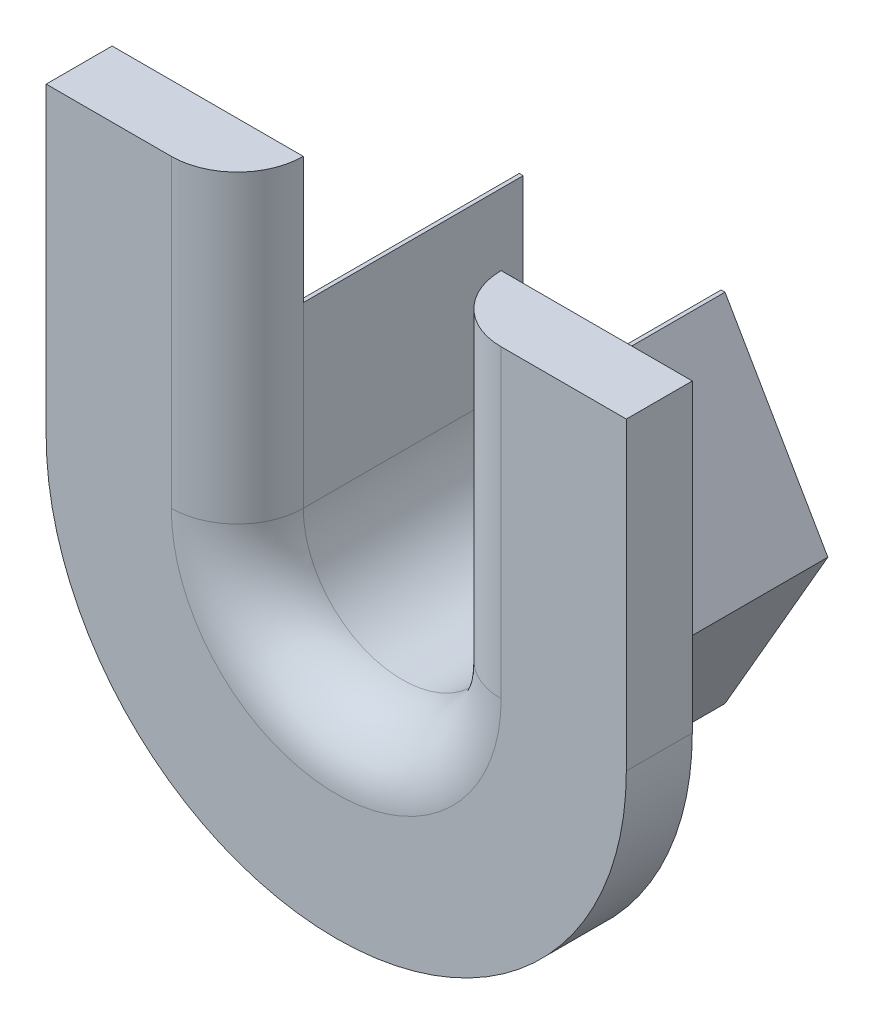
ISO-10303-21;
HEADER;
FILE_DESCRIPTION(('STEP AP214'),'2;1');
FILE_NAME('part.step','',(''),(''),'','','');
FILE_SCHEMA(('AUTOMOTIVE_DESIGN { 1 0 10303 214 1 1 1 1 }'));
ENDSEC;
DATA;
#1=APPLICATION_CONTEXT('core data for automotive mechanical design processes');
#2=APPLICATION_PROTOCOL_DEFINITION('international standard','automotive_design',2000,#1);
#3=PRODUCT_CONTEXT('',#1,'mechanical');
#4=PRODUCT('Part','Part','',(#3));
#5=PRODUCT_RELATED_PRODUCT_CATEGORY('part','',(#4));
#6=PRODUCT_DEFINITION_FORMATION('','',#4);
#7=PRODUCT_DEFINITION_CONTEXT('part definition',#1,'design');
#8=PRODUCT_DEFINITION('design','',#6,#7);
#9=PRODUCT_DEFINITION_SHAPE('','',#8);
#10=(LENGTH_UNIT() NAMED_UNIT(*) SI_UNIT(.MILLI.,.METRE.));
#11=(NAMED_UNIT(*) PLANE_ANGLE_UNIT() SI_UNIT($,.RADIAN.));
#12=(NAMED_UNIT(*) SI_UNIT($,.STERADIAN.) SOLID_ANGLE_UNIT());
#13=UNCERTAINTY_MEASURE_WITH_UNIT(LENGTH_MEASURE(1.E-05),#10,'distance_accuracy_value','');
#14=(GEOMETRIC_REPRESENTATION_CONTEXT(3) GLOBAL_UNCERTAINTY_ASSIGNED_CONTEXT((#13)) GLOBAL_UNIT_ASSIGNED_CONTEXT((#10,
#11,#12)) REPRESENTATION_CONTEXT('',''));
#15=CARTESIAN_POINT('',(0.,0.,0.));
#16=DIRECTION('',(0.,0.,1.));
#17=DIRECTION('',(1.,0.,0.));
#18=AXIS2_PLACEMENT_3D('',#15,#16,#17);
#19=CARTESIAN_POINT('',(7.48,-24.18,-5.));
#20=DIRECTION('',(0.,0.,1.));
#21=DIRECTION('',(1.,0.,0.));
#22=AXIS2_PLACEMENT_3D('',#19,#20,#21);
#23=CYLINDRICAL_SURFACE('',#22,2.25);
#24=DIRECTION('',(0.,0.,1.));
#25=VECTOR('',#24,1.);
#26=CARTESIAN_POINT('',(5.23,-24.18,-5.));
#27=LINE('',#26,#25);
#28=CARTESIAN_POINT('',(5.23,-24.18,-5.));
#29=VERTEX_POINT('',#28);
#30=CARTESIAN_POINT('',(5.23,-24.18,0.));
#31=VERTEX_POINT('',#30);
#32=EDGE_CURVE('E234',#29,#31,#27,.T.);
#33=ORIENTED_EDGE('',*,*,#32,.T.);
#34=CARTESIAN_POINT('',(7.48,-24.18,0.));
#35=DIRECTION('',(0.,0.,1.));
#36=DIRECTION('',(1.,0.,0.));
#37=AXIS2_PLACEMENT_3D('',#34,#35,#36);
#38=CIRCLE('',#37,2.25);
#39=CARTESIAN_POINT('',(9.73000000000001,-24.18,0.));
#40=VERTEX_POINT('',#39);
#41=EDGE_CURVE('E11',#31,#40,#38,.T.);
#42=ORIENTED_EDGE('',*,*,#41,.T.);
#43=DIRECTION('',(0.,0.,1.));
#44=VECTOR('',#43,1.);
#45=CARTESIAN_POINT('',(9.73000000000001,-24.18,-5.));
#46=LINE('',#45,#44);
#47=CARTESIAN_POINT('',(9.73000000000001,-24.18,-5.));
#48=VERTEX_POINT('',#47);
#49=EDGE_CURVE('E252',#48,#40,#46,.T.);
#50=ORIENTED_EDGE('',*,*,#49,.F.);
#51=CARTESIAN_POINT('',(7.48,-24.18,-5.));
#52=DIRECTION('',(0.,0.,1.));
#53=DIRECTION('',(1.,0.,0.));
#54=AXIS2_PLACEMENT_3D('',#51,#52,#53);
#55=CIRCLE('',#54,2.25);
#56=EDGE_CURVE('E206',#29,#48,#55,.T.);
#57=ORIENTED_EDGE('',*,*,#56,.F.);
#58=EDGE_LOOP('',(#33,#42,#50,#57));
#59=FACE_BOUND('',#58,.T.);
#60=ADVANCED_FACE('F35',(#59),#23,.F.);
#61=CARTESIAN_POINT('',(9.73,0.,-5.));
#62=DIRECTION('',(1.,0.,0.));
#63=DIRECTION('',(0.,1.,0.));
#64=AXIS2_PLACEMENT_3D('',#61,#62,#63);
#65=PLANE('',#64);
#66=ORIENTED_EDGE('',*,*,#49,.T.);
#67=DIRECTION('',(0.,1.,0.));
#68=VECTOR('',#67,1.);
#69=CARTESIAN_POINT('',(9.73,-17.25,0.));
#70=LINE('',#69,#68);
#71=CARTESIAN_POINT('',(9.73,-20.13,0.));
#72=VERTEX_POINT('',#71);
#73=EDGE_CURVE('E255',#40,#72,#70,.T.);
#74=ORIENTED_EDGE('',*,*,#73,.T.);
#75=DIRECTION('',(0.,0.,1.));
#76=VECTOR('',#75,1.);
#77=CARTESIAN_POINT('',(9.73,-20.13,-5.));
#78=LINE('',#77,#76);
#79=CARTESIAN_POINT('',(9.73,-20.13,-5.));
#80=VERTEX_POINT('',#79);
#81=EDGE_CURVE('E256',#80,#72,#78,.T.);
#82=ORIENTED_EDGE('',*,*,#81,.F.);
#83=DIRECTION('',(0.,1.,0.));
#84=VECTOR('',#83,1.);
#85=CARTESIAN_POINT('',(9.73,0.,-5.));
#86=LINE('',#85,#84);
#87=EDGE_CURVE('E232',#48,#80,#86,.T.);
#88=ORIENTED_EDGE('',*,*,#87,.F.);
#89=EDGE_LOOP('',(#66,#74,#82,#88));
#90=FACE_BOUND('',#89,.T.);
#91=ADVANCED_FACE('F317',(#90),#65,.F.);
#92=CARTESIAN_POINT('',(0.,-20.13,-5.));
#93=DIRECTION('',(0.,1.,0.));
#94=DIRECTION('',(-1.,0.,0.));
#95=AXIS2_PLACEMENT_3D('',#92,#93,#94);
#96=PLANE('',#95);
#97=DIRECTION('',(-1.,0.,0.));
#98=VECTOR('',#97,1.);
#99=CARTESIAN_POINT('',(0.,-20.13,0.));
#100=LINE('',#99,#98);
#101=CARTESIAN_POINT('',(9.81826859021798,-20.13,0.));
#102=VERTEX_POINT('',#101);
#103=EDGE_CURVE('E210',#102,#72,#100,.T.);
#104=ORIENTED_EDGE('',*,*,#103,.F.);
#105=DIRECTION('',(0.,0.,1.));
#106=VECTOR('',#105,1.);
#107=CARTESIAN_POINT('',(9.81826859021798,-20.13,-5.));
#108=LINE('',#107,#106);
#109=CARTESIAN_POINT('',(9.81826859021798,-20.13,-5.));
#110=VERTEX_POINT('',#109);
#111=EDGE_CURVE('E259',#110,#102,#108,.T.);
#112=ORIENTED_EDGE('',*,*,#111,.F.);
#113=DIRECTION('',(-1.,0.,0.));
#114=VECTOR('',#113,1.);
#115=CARTESIAN_POINT('',(0.,-20.13,-5.));
#116=LINE('',#115,#114);
#117=EDGE_CURVE('E217',#110,#80,#116,.T.);
#118=ORIENTED_EDGE('',*,*,#117,.T.);
#119=ORIENTED_EDGE('',*,*,#81,.T.);
#120=EDGE_LOOP('',(#104,#112,#118,#119));
#121=FACE_BOUND('',#120,.T.);
#122=ADVANCED_FACE('F322',(#121),#96,.T.);
#123=CARTESIAN_POINT('',(-1.3528442464269,-0.781064989846206,-5.));
#124=DIRECTION('',(0.866025403784438,0.5,0.));
#125=DIRECTION('',(-0.5,0.866025403784438,0.));
#126=AXIS2_PLACEMENT_3D('',#123,#124,#125);
#127=PLANE('',#126);
#128=DIRECTION('',(-0.5,0.866025403784438,0.));
#129=VECTOR('',#128,1.);
#130=CARTESIAN_POINT('',(-1.3528442464269,-0.781064989846206,0.));
#131=LINE('',#130,#129);
#132=CARTESIAN_POINT('',(12.156537180436,-24.18,0.));
#133=VERTEX_POINT('',#132);
#134=EDGE_CURVE('E249',#133,#102,#131,.T.);
#135=ORIENTED_EDGE('',*,*,#134,.F.);
#136=DIRECTION('',(0.,0.,1.));
#137=VECTOR('',#136,1.);
#138=CARTESIAN_POINT('',(12.156537180436,-24.18,-5.));
#139=LINE('',#138,#137);
#140=CARTESIAN_POINT('',(12.156537180436,-24.18,-5.));
#141=VERTEX_POINT('',#140);
#142=EDGE_CURVE('E261',#141,#133,#139,.T.);
#143=ORIENTED_EDGE('',*,*,#142,.F.);
#144=DIRECTION('',(-0.5,0.866025403784438,0.));
#145=VECTOR('',#144,1.);
#146=CARTESIAN_POINT('',(-1.3528442464269,-0.781064989846206,-5.));
#147=LINE('',#146,#145);
#148=EDGE_CURVE('E229',#141,#110,#147,.T.);
#149=ORIENTED_EDGE('',*,*,#148,.T.);
#150=ORIENTED_EDGE('',*,*,#111,.T.);
#151=EDGE_LOOP('',(#135,#143,#149,#150));
#152=FACE_BOUND('',#151,.T.);
#153=ADVANCED_FACE('F327',(#152),#127,.T.);
#154=CARTESIAN_POINT('',(19.5876500170808,-11.3089350101538,-5.));
#155=DIRECTION('',(0.866025403784438,-0.5,0.));
#156=DIRECTION('',(0.5,0.866025403784438,0.));
#157=AXIS2_PLACEMENT_3D('',#154,#155,#156);
#158=PLANE('',#157);
#159=DIRECTION('',(0.5,0.866025403784439,0.));
#160=VECTOR('',#159,1.);
#161=CARTESIAN_POINT('',(19.5876500170808,-11.3089350101538,0.));
#162=LINE('',#161,#160);
#163=CARTESIAN_POINT('',(9.81826859021799,-28.23,0.));
#164=VERTEX_POINT('',#163);
#165=EDGE_CURVE('E246',#164,#133,#162,.T.);
#166=ORIENTED_EDGE('',*,*,#165,.F.);
#167=DIRECTION('',(0.,0.,1.));
#168=VECTOR('',#167,1.);
#169=CARTESIAN_POINT('',(9.81826859021799,-28.23,-5.));
#170=LINE('',#169,#168);
#171=CARTESIAN_POINT('',(9.81826859021799,-28.23,-5.));
#172=VERTEX_POINT('',#171);
#173=EDGE_CURVE('E263',#172,#164,#170,.T.);
#174=ORIENTED_EDGE('',*,*,#173,.F.);
#175=DIRECTION('',(0.5,0.866025403784439,0.));
#176=VECTOR('',#175,1.);
#177=CARTESIAN_POINT('',(19.5876500170808,-11.3089350101538,-5.));
#178=LINE('',#177,#176);
#179=EDGE_CURVE('E226',#172,#141,#178,.T.);
#180=ORIENTED_EDGE('',*,*,#179,.T.);
#181=ORIENTED_EDGE('',*,*,#142,.T.);
#182=EDGE_LOOP('',(#166,#174,#180,#181));
#183=FACE_BOUND('',#182,.T.);
#184=ADVANCED_FACE('F353',(#183),#158,.T.);
#185=CARTESIAN_POINT('',(0.,-28.23,-5.));
#186=DIRECTION('',(0.,-1.,0.));
#187=DIRECTION('',(1.,0.,0.));
#188=AXIS2_PLACEMENT_3D('',#185,#186,#187);
#189=PLANE('',#188);
#190=DIRECTION('',(1.,0.,0.));
#191=VECTOR('',#190,1.);
#192=CARTESIAN_POINT('',(0.,-28.23,0.));
#193=LINE('',#192,#191);
#194=CARTESIAN_POINT('',(5.14173140978203,-28.23,0.));
#195=VERTEX_POINT('',#194);
#196=EDGE_CURVE('E243',#195,#164,#193,.T.);
#197=ORIENTED_EDGE('',*,*,#196,.F.);
#198=DIRECTION('',(0.,0.,1.));
#199=VECTOR('',#198,1.);
#200=CARTESIAN_POINT('',(5.14173140978203,-28.23,-5.));
#201=LINE('',#200,#199);
#202=CARTESIAN_POINT('',(5.14173140978203,-28.23,-5.));
#203=VERTEX_POINT('',#202);
#204=EDGE_CURVE('E265',#203,#195,#201,.T.);
#205=ORIENTED_EDGE('',*,*,#204,.F.);
#206=DIRECTION('',(1.,0.,0.));
#207=VECTOR('',#206,1.);
#208=CARTESIAN_POINT('',(0.,-28.23,-5.));
#209=LINE('',#208,#207);
#210=EDGE_CURVE('E223',#203,#172,#209,.T.);
#211=ORIENTED_EDGE('',*,*,#210,.T.);
#212=ORIENTED_EDGE('',*,*,#173,.T.);
#213=EDGE_LOOP('',(#197,#205,#211,#212));
#214=FACE_BOUND('',#213,.T.);
#215=ADVANCED_FACE('F351',(#214),#189,.T.);
#216=CARTESIAN_POINT('',(-8.36765001708084,-4.8310649898462,-5.));
#217=DIRECTION('',(-0.866025403784439,-0.5,0.));
#218=DIRECTION('',(0.5,-0.866025403784439,0.));
#219=AXIS2_PLACEMENT_3D('',#216,#217,#218);
#220=PLANE('',#219);
#221=DIRECTION('',(0.5,-0.866025403784439,0.));
#222=VECTOR('',#221,1.);
#223=CARTESIAN_POINT('',(-8.36765001708084,-4.8310649898462,0.));
#224=LINE('',#223,#222);
#225=CARTESIAN_POINT('',(2.80346281956404,-24.18,0.));
#226=VERTEX_POINT('',#225);
#227=EDGE_CURVE('E240',#226,#195,#224,.T.);
#228=ORIENTED_EDGE('',*,*,#227,.F.);
#229=DIRECTION('',(0.,0.,1.));
#230=VECTOR('',#229,1.);
#231=CARTESIAN_POINT('',(2.80346281956404,-24.18,-5.));
#232=LINE('',#231,#230);
#233=CARTESIAN_POINT('',(2.80346281956404,-24.18,-5.));
#234=VERTEX_POINT('',#233);
#235=EDGE_CURVE('E267',#234,#226,#232,.T.);
#236=ORIENTED_EDGE('',*,*,#235,.F.);
#237=DIRECTION('',(0.5,-0.866025403784439,0.));
#238=VECTOR('',#237,1.);
#239=CARTESIAN_POINT('',(-8.36765001708084,-4.8310649898462,-5.));
#240=LINE('',#239,#238);
#241=EDGE_CURVE('E220',#234,#203,#240,.T.);
#242=ORIENTED_EDGE('',*,*,#241,.T.);
#243=ORIENTED_EDGE('',*,*,#204,.T.);
#244=EDGE_LOOP('',(#228,#236,#242,#243));
#245=FACE_BOUND('',#244,.T.);
#246=ADVANCED_FACE('F347',(#245),#220,.T.);
#247=CARTESIAN_POINT('',(12.5728442464269,-7.25893501015381,-5.));
#248=DIRECTION('',(-0.866025403784438,0.5,0.));
#249=DIRECTION('',(-0.5,-0.866025403784438,0.));
#250=AXIS2_PLACEMENT_3D('',#247,#248,#249);
#251=PLANE('',#250);
#252=DIRECTION('',(-0.5,-0.866025403784439,0.));
#253=VECTOR('',#252,1.);
#254=CARTESIAN_POINT('',(12.5728442464269,-7.25893501015381,0.));
#255=LINE('',#254,#253);
#256=CARTESIAN_POINT('',(5.14173140978202,-20.13,0.));
#257=VERTEX_POINT('',#256);
#258=EDGE_CURVE('E237',#257,#226,#255,.T.);
#259=ORIENTED_EDGE('',*,*,#258,.F.);
#260=DIRECTION('',(0.,0.,1.));
#261=VECTOR('',#260,1.);
#262=CARTESIAN_POINT('',(5.14173140978202,-20.13,-5.));
#263=LINE('',#262,#261);
#264=CARTESIAN_POINT('',(5.14173140978202,-20.13,-5.));
#265=VERTEX_POINT('',#264);
#266=EDGE_CURVE('E269',#265,#257,#263,.T.);
#267=ORIENTED_EDGE('',*,*,#266,.F.);
#268=DIRECTION('',(-0.5,-0.866025403784439,0.));
#269=VECTOR('',#268,1.);
#270=CARTESIAN_POINT('',(12.5728442464269,-7.25893501015381,-5.));
#271=LINE('',#270,#269);
#272=EDGE_CURVE('E216',#265,#234,#271,.T.);
#273=ORIENTED_EDGE('',*,*,#272,.T.);
#274=ORIENTED_EDGE('',*,*,#235,.T.);
#275=EDGE_LOOP('',(#259,#267,#273,#274));
#276=FACE_BOUND('',#275,.T.);
#277=ADVANCED_FACE('F343',(#276),#251,.T.);
#278=CARTESIAN_POINT('',(5.23,-20.13,0.));
#279=VERTEX_POINT('',#278);
#280=EDGE_CURVE('E171',#279,#257,#100,.T.);
#281=ORIENTED_EDGE('',*,*,#280,.F.);
#282=DIRECTION('',(0.,0.,1.));
#283=VECTOR('',#282,1.);
#284=CARTESIAN_POINT('',(5.23,-20.13,-5.));
#285=LINE('',#284,#283);
#286=CARTESIAN_POINT('',(5.23,-20.13,-5.));
#287=VERTEX_POINT('',#286);
#288=EDGE_CURVE('E271',#287,#279,#285,.T.);
#289=ORIENTED_EDGE('',*,*,#288,.F.);
#290=EDGE_CURVE('E213',#287,#265,#116,.T.);
#291=ORIENTED_EDGE('',*,*,#290,.T.);
#292=ORIENTED_EDGE('',*,*,#266,.T.);
#293=EDGE_LOOP('',(#281,#289,#291,#292));
#294=FACE_BOUND('',#293,.T.);
#295=ADVANCED_FACE('F339',(#294),#96,.T.);
#296=CARTESIAN_POINT('',(5.23000000000001,0.,-5.));
#297=DIRECTION('',(1.,0.,0.));
#298=DIRECTION('',(0.,1.,0.));
#299=AXIS2_PLACEMENT_3D('',#296,#297,#298);
#300=PLANE('',#299);
#301=ORIENTED_EDGE('',*,*,#288,.T.);
#302=DIRECTION('',(0.,1.,0.));
#303=VECTOR('',#302,1.);
#304=CARTESIAN_POINT('',(5.23000000000001,0.,0.));
#305=LINE('',#304,#303);
#306=EDGE_CURVE('E44',#279,#31,#305,.F.);
#307=ORIENTED_EDGE('',*,*,#306,.T.);
#308=ORIENTED_EDGE('',*,*,#32,.F.);
#309=DIRECTION('',(0.,1.,0.));
#310=VECTOR('',#309,1.);
#311=CARTESIAN_POINT('',(5.23000000000001,0.,-5.));
#312=LINE('',#311,#310);
#313=EDGE_CURVE('E209',#29,#287,#312,.T.);
#314=ORIENTED_EDGE('',*,*,#313,.T.);
#315=EDGE_LOOP('',(#301,#307,#308,#314));
#316=FACE_BOUND('',#315,.T.);
#317=ADVANCED_FACE('F336',(#316),#300,.T.);
#318=CARTESIAN_POINT('',(0.,0.,-5.));
#319=DIRECTION('',(0.,0.,1.));
#320=DIRECTION('',(1.,0.,0.));
#321=AXIS2_PLACEMENT_3D('',#318,#319,#320);
#322=PLANE('',#321);
#323=ORIENTED_EDGE('',*,*,#56,.T.);
#324=ORIENTED_EDGE('',*,*,#87,.T.);
#325=ORIENTED_EDGE('',*,*,#117,.F.);
#326=ORIENTED_EDGE('',*,*,#148,.F.);
#327=ORIENTED_EDGE('',*,*,#179,.F.);
#328=ORIENTED_EDGE('',*,*,#210,.F.);
#329=ORIENTED_EDGE('',*,*,#241,.F.);
#330=ORIENTED_EDGE('',*,*,#272,.F.);
#331=ORIENTED_EDGE('',*,*,#290,.F.);
#332=ORIENTED_EDGE('',*,*,#313,.F.);
#333=EDGE_LOOP('',(#323,#324,#325,#326,#327,#328,#329,#330,#331,#332));
#334=FACE_BOUND('',#333,.T.);
#335=ADVANCED_FACE('F330',(#334),#322,.F.);
#336=CARTESIAN_POINT('',(0.,0.,0.));
#337=DIRECTION('',(0.,0.,1.));
#338=DIRECTION('',(1.,0.,0.));
#339=AXIS2_PLACEMENT_3D('',#336,#337,#338);
#340=PLANE('',#339);
#341=DIRECTION('',(0.,1.,0.));
#342=VECTOR('',#341,1.);
#343=CARTESIAN_POINT('',(5.23,0.,0.));
#344=LINE('',#343,#342);
#345=CARTESIAN_POINT('',(5.23,-17.25,0.));
#346=VERTEX_POINT('',#345);
#347=EDGE_CURVE('E188',#279,#346,#344,.T.);
#348=ORIENTED_EDGE('',*,*,#347,.F.);
#349=ORIENTED_EDGE('',*,*,#280,.T.);
#350=ORIENTED_EDGE('',*,*,#258,.T.);
#351=ORIENTED_EDGE('',*,*,#227,.T.);
#352=ORIENTED_EDGE('',*,*,#196,.T.);
#353=ORIENTED_EDGE('',*,*,#165,.T.);
#354=ORIENTED_EDGE('',*,*,#134,.T.);
#355=ORIENTED_EDGE('',*,*,#103,.T.);
#356=DIRECTION('',(0.,1.,0.));
#357=VECTOR('',#356,1.);
#358=CARTESIAN_POINT('',(9.73000000000002,0.,0.));
#359=LINE('',#358,#357);
#360=CARTESIAN_POINT('',(9.73000000000001,-17.25,0.));
#361=VERTEX_POINT('',#360);
#362=EDGE_CURVE('E186',#72,#361,#359,.T.);
#363=ORIENTED_EDGE('',*,*,#362,.T.);
#364=DIRECTION('',(-1.,0.,0.));
#365=VECTOR('',#364,1.);
#366=CARTESIAN_POINT('',(0.,-17.25,0.));
#367=LINE('',#366,#365);
#368=CARTESIAN_POINT('',(14.075,-17.25,0.));
#369=VERTEX_POINT('',#368);
#370=EDGE_CURVE('E162',#369,#361,#367,.T.);
#371=ORIENTED_EDGE('',*,*,#370,.F.);
#372=DIRECTION('',(0.,1.,0.));
#373=VECTOR('',#372,1.);
#374=CARTESIAN_POINT('',(14.075,0.,0.));
#375=LINE('',#374,#373);
#376=CARTESIAN_POINT('',(14.075,-24.18,0.));
#377=VERTEX_POINT('',#376);
#378=EDGE_CURVE('E196',#377,#369,#375,.T.);
#379=ORIENTED_EDGE('',*,*,#378,.F.);
#380=CARTESIAN_POINT('',(7.48000000000001,-24.18,0.));
#381=DIRECTION('',(0.,0.,1.));
#382=DIRECTION('',(1.,0.,0.));
#383=AXIS2_PLACEMENT_3D('',#380,#381,#382);
#384=CIRCLE('',#383,6.59499999999999);
#385=CARTESIAN_POINT('',(0.885000000000016,-24.18,0.));
#386=VERTEX_POINT('',#385);
#387=EDGE_CURVE('E194',#386,#377,#384,.T.);
#388=ORIENTED_EDGE('',*,*,#387,.F.);
#389=DIRECTION('',(0.,-1.,0.));
#390=VECTOR('',#389,1.);
#391=CARTESIAN_POINT('',(0.885000000000016,0.,0.));
#392=LINE('',#391,#390);
#393=CARTESIAN_POINT('',(0.885000000000016,-17.25,0.));
#394=VERTEX_POINT('',#393);
#395=EDGE_CURVE('E192',#394,#386,#392,.T.);
#396=ORIENTED_EDGE('',*,*,#395,.F.);
#397=DIRECTION('',(-1.,0.,0.));
#398=VECTOR('',#397,1.);
#399=CARTESIAN_POINT('',(0.,-17.25,0.));
#400=LINE('',#399,#398);
#401=EDGE_CURVE('E168',#346,#394,#400,.T.);
#402=ORIENTED_EDGE('',*,*,#401,.F.);
#403=EDGE_LOOP('',(#348,#349,#350,#351,#352,#353,#354,#355,#363,#371,#379,#388,#396,#402));
#404=FACE_BOUND('',#403,.T.);
#405=ADVANCED_FACE('F298',(#404),#340,.F.);
#406=CARTESIAN_POINT('',(0.,-17.25,1.5));
#407=DIRECTION('',(0.,-1.,0.));
#408=DIRECTION('',(0.,0.,-1.));
#409=AXIS2_PLACEMENT_3D('',#406,#407,#408);
#410=PLANE('',#409);
#411=DIRECTION('',(-1.,0.,0.));
#412=VECTOR('',#411,1.);
#413=CARTESIAN_POINT('',(0.,-17.25,1.5));
#414=LINE('',#413,#412);
#415=CARTESIAN_POINT('',(3.73,-17.25,1.5));
#416=VERTEX_POINT('',#415);
#417=CARTESIAN_POINT('',(0.885000000000016,-17.25,1.5));
#418=VERTEX_POINT('',#417);
#419=EDGE_CURVE('E152',#416,#418,#414,.T.);
#420=ORIENTED_EDGE('',*,*,#419,.F.);
#421=CARTESIAN_POINT('',(3.73,-17.25,0.));
#422=DIRECTION('',(0.,-1.,0.));
#423=DIRECTION('',(0.,0.,-1.));
#424=AXIS2_PLACEMENT_3D('',#421,#422,#423);
#425=CIRCLE('',#424,1.5);
#426=EDGE_CURVE('E282',#416,#346,#425,.F.);
#427=ORIENTED_EDGE('',*,*,#426,.T.);
#428=ORIENTED_EDGE('',*,*,#401,.T.);
#429=DIRECTION('',(0.,0.,-1.));
#430=VECTOR('',#429,1.);
#431=CARTESIAN_POINT('',(0.885000000000016,-17.25,1.5));
#432=LINE('',#431,#430);
#433=EDGE_CURVE('E165',#418,#394,#432,.T.);
#434=ORIENTED_EDGE('',*,*,#433,.F.);
#435=EDGE_LOOP('',(#420,#427,#428,#434));
#436=FACE_BOUND('',#435,.T.);
#437=ADVANCED_FACE('F166',(#436),#410,.F.);
#438=CARTESIAN_POINT('',(0.885000000000016,0.,1.5));
#439=DIRECTION('',(1.,0.,0.));
#440=DIRECTION('',(0.,0.,-1.));
#441=AXIS2_PLACEMENT_3D('',#438,#439,#440);
#442=PLANE('',#441);
#443=ORIENTED_EDGE('',*,*,#395,.T.);
#444=DIRECTION('',(0.,0.,-1.));
#445=VECTOR('',#444,1.);
#446=CARTESIAN_POINT('',(0.885000000000016,-24.18,1.5));
#447=LINE('',#446,#445);
#448=CARTESIAN_POINT('',(0.885000000000016,-24.18,1.5));
#449=VERTEX_POINT('',#448);
#450=EDGE_CURVE('E172',#449,#386,#447,.T.);
#451=ORIENTED_EDGE('',*,*,#450,.F.);
#452=DIRECTION('',(0.,-1.,0.));
#453=VECTOR('',#452,1.);
#454=CARTESIAN_POINT('',(0.885000000000016,0.,1.5));
#455=LINE('',#454,#453);
#456=EDGE_CURVE('E157',#418,#449,#455,.T.);
#457=ORIENTED_EDGE('',*,*,#456,.F.);
#458=ORIENTED_EDGE('',*,*,#433,.T.);
#459=EDGE_LOOP('',(#443,#451,#457,#458));
#460=FACE_BOUND('',#459,.T.);
#461=ADVANCED_FACE('F174',(#460),#442,.F.);
#462=CARTESIAN_POINT('',(7.48000000000001,-24.18,1.5));
#463=DIRECTION('',(0.,0.,-1.));
#464=DIRECTION('',(-1.,0.,0.));
#465=AXIS2_PLACEMENT_3D('',#462,#463,#464);
#466=CYLINDRICAL_SURFACE('',#465,6.59499999999999);
#467=ORIENTED_EDGE('',*,*,#387,.T.);
#468=DIRECTION('',(0.,0.,-1.));
#469=VECTOR('',#468,1.);
#470=CARTESIAN_POINT('',(14.075,-24.18,1.5));
#471=LINE('',#470,#469);
#472=CARTESIAN_POINT('',(14.075,-24.18,1.5));
#473=VERTEX_POINT('',#472);
#474=EDGE_CURVE('E202',#473,#377,#471,.T.);
#475=ORIENTED_EDGE('',*,*,#474,.F.);
#476=CARTESIAN_POINT('',(7.48000000000001,-24.18,1.5));
#477=DIRECTION('',(0.,0.,1.));
#478=DIRECTION('',(1.,0.,0.));
#479=AXIS2_PLACEMENT_3D('',#476,#477,#478);
#480=CIRCLE('',#479,6.59499999999999);
#481=EDGE_CURVE('E177',#449,#473,#480,.T.);
#482=ORIENTED_EDGE('',*,*,#481,.F.);
#483=ORIENTED_EDGE('',*,*,#450,.T.);
#484=EDGE_LOOP('',(#467,#475,#482,#483));
#485=FACE_BOUND('',#484,.T.);
#486=ADVANCED_FACE('F302',(#485),#466,.T.);
#487=CARTESIAN_POINT('',(14.075,0.,1.5));
#488=DIRECTION('',(-1.,0.,0.));
#489=DIRECTION('',(0.,0.,1.));
#490=AXIS2_PLACEMENT_3D('',#487,#488,#489);
#491=PLANE('',#490);
#492=ORIENTED_EDGE('',*,*,#378,.T.);
#493=DIRECTION('',(0.,0.,-1.));
#494=VECTOR('',#493,1.);
#495=CARTESIAN_POINT('',(14.075,-17.25,1.5));
#496=LINE('',#495,#494);
#497=CARTESIAN_POINT('',(14.075,-17.25,1.5));
#498=VERTEX_POINT('',#497);
#499=EDGE_CURVE('E185',#498,#369,#496,.T.);
#500=ORIENTED_EDGE('',*,*,#499,.F.);
#501=DIRECTION('',(0.,1.,0.));
#502=VECTOR('',#501,1.);
#503=CARTESIAN_POINT('',(14.075,0.,1.5));
#504=LINE('',#503,#502);
#505=EDGE_CURVE('E179',#473,#498,#504,.T.);
#506=ORIENTED_EDGE('',*,*,#505,.F.);
#507=ORIENTED_EDGE('',*,*,#474,.T.);
#508=EDGE_LOOP('',(#492,#500,#506,#507));
#509=FACE_BOUND('',#508,.T.);
#510=ADVANCED_FACE('F308',(#509),#491,.F.);
#511=CARTESIAN_POINT('',(0.,-17.25,1.5));
#512=DIRECTION('',(0.,-1.,0.));
#513=DIRECTION('',(0.,0.,-1.));
#514=AXIS2_PLACEMENT_3D('',#511,#512,#513);
#515=PLANE('',#514);
#516=ORIENTED_EDGE('',*,*,#370,.T.);
#517=CARTESIAN_POINT('',(11.23,-17.25,0.));
#518=DIRECTION('',(0.,-1.,0.));
#519=DIRECTION('',(0.,0.,-1.));
#520=AXIS2_PLACEMENT_3D('',#517,#518,#519);
#521=CIRCLE('',#520,1.5);
#522=CARTESIAN_POINT('',(11.23,-17.25,1.5));
#523=VERTEX_POINT('',#522);
#524=EDGE_CURVE('E276',#361,#523,#521,.F.);
#525=ORIENTED_EDGE('',*,*,#524,.T.);
#526=DIRECTION('',(-1.,0.,0.));
#527=VECTOR('',#526,1.);
#528=CARTESIAN_POINT('',(0.,-17.25,1.5));
#529=LINE('',#528,#527);
#530=EDGE_CURVE('E183',#498,#523,#529,.T.);
#531=ORIENTED_EDGE('',*,*,#530,.F.);
#532=ORIENTED_EDGE('',*,*,#499,.T.);
#533=EDGE_LOOP('',(#516,#525,#531,#532));
#534=FACE_BOUND('',#533,.T.);
#535=ADVANCED_FACE('F311',(#534),#515,.F.);
#536=CARTESIAN_POINT('',(0.,0.,1.5));
#537=DIRECTION('',(0.,0.,1.));
#538=DIRECTION('',(1.,0.,0.));
#539=AXIS2_PLACEMENT_3D('',#536,#537,#538);
#540=PLANE('',#539);
#541=ORIENTED_EDGE('',*,*,#530,.T.);
#542=DIRECTION('',(0.,1.,0.));
#543=VECTOR('',#542,1.);
#544=CARTESIAN_POINT('',(11.23,-24.18,1.5));
#545=LINE('',#544,#543);
#546=CARTESIAN_POINT('',(11.23,-24.18,1.5));
#547=VERTEX_POINT('',#546);
#548=EDGE_CURVE('E280',#523,#547,#545,.F.);
#549=ORIENTED_EDGE('',*,*,#548,.T.);
#550=CARTESIAN_POINT('',(7.48,-24.18,1.5));
#551=DIRECTION('',(0.,0.,1.));
#552=DIRECTION('',(1.,0.,0.));
#553=AXIS2_PLACEMENT_3D('',#550,#551,#552);
#554=CIRCLE('',#553,3.75);
#555=CARTESIAN_POINT('',(3.73,-24.18,1.5));
#556=VERTEX_POINT('',#555);
#557=EDGE_CURVE('E59',#547,#556,#554,.F.);
#558=ORIENTED_EDGE('',*,*,#557,.T.);
#559=DIRECTION('',(0.,1.,0.));
#560=VECTOR('',#559,1.);
#561=CARTESIAN_POINT('',(3.73000000000001,0.,1.5));
#562=LINE('',#561,#560);
#563=EDGE_CURVE('E159',#556,#416,#562,.T.);
#564=ORIENTED_EDGE('',*,*,#563,.T.);
#565=ORIENTED_EDGE('',*,*,#419,.T.);
#566=ORIENTED_EDGE('',*,*,#456,.T.);
#567=ORIENTED_EDGE('',*,*,#481,.T.);
#568=ORIENTED_EDGE('',*,*,#505,.T.);
#569=EDGE_LOOP('',(#541,#549,#558,#564,#565,#566,#567,#568));
#570=FACE_BOUND('',#569,.T.);
#571=ADVANCED_FACE('F155',(#570),#540,.T.);
#572=CARTESIAN_POINT('',(3.73000000000001,0.,0.));
#573=DIRECTION('',(0.,1.,0.));
#574=DIRECTION('',(-1.,0.,0.));
#575=AXIS2_PLACEMENT_3D('',#572,#573,#574);
#576=CYLINDRICAL_SURFACE('',#575,1.5);
#577=ORIENTED_EDGE('',*,*,#426,.F.);
#578=ORIENTED_EDGE('',*,*,#563,.F.);
#579=CARTESIAN_POINT('',(3.73,-24.18,0.));
#580=DIRECTION('',(0.,-1.,0.));
#581=DIRECTION('',(0.,0.,-1.));
#582=AXIS2_PLACEMENT_3D('',#579,#580,#581);
#583=CIRCLE('',#582,1.5);
#584=EDGE_CURVE('E39',#31,#556,#583,.T.);
#585=ORIENTED_EDGE('',*,*,#584,.F.);
#586=ORIENTED_EDGE('',*,*,#306,.F.);
#587=ORIENTED_EDGE('',*,*,#347,.T.);
#588=EDGE_LOOP('',(#577,#578,#585,#586,#587));
#589=FACE_BOUND('',#588,.T.);
#590=ADVANCED_FACE('F37',(#589),#576,.T.);
#591=CARTESIAN_POINT('',(7.48,-24.18,0.));
#592=DIRECTION('',(0.,0.,1.));
#593=DIRECTION('',(1.,0.,0.));
#594=AXIS2_PLACEMENT_3D('',#591,#592,#593);
#595=TOROIDAL_SURFACE('',#594,3.75,1.5);
#596=ORIENTED_EDGE('',*,*,#584,.T.);
#597=ORIENTED_EDGE('',*,*,#557,.F.);
#598=CARTESIAN_POINT('',(11.23,-24.18,0.));
#599=DIRECTION('',(0.,1.,0.));
#600=DIRECTION('',(0.,0.,1.));
#601=AXIS2_PLACEMENT_3D('',#598,#599,#600);
#602=CIRCLE('',#601,1.5);
#603=EDGE_CURVE('E284',#40,#547,#602,.T.);
#604=ORIENTED_EDGE('',*,*,#603,.F.);
#605=ORIENTED_EDGE('',*,*,#41,.F.);
#606=EDGE_LOOP('',(#596,#597,#604,#605));
#607=FACE_BOUND('',#606,.T.);
#608=ADVANCED_FACE('F294',(#607),#595,.T.);
#609=CARTESIAN_POINT('',(11.23,0.,0.));
#610=DIRECTION('',(0.,-1.,0.));
#611=DIRECTION('',(1.,0.,0.));
#612=AXIS2_PLACEMENT_3D('',#609,#610,#611);
#613=CYLINDRICAL_SURFACE('',#612,1.5);
#614=ORIENTED_EDGE('',*,*,#603,.T.);
#615=ORIENTED_EDGE('',*,*,#548,.F.);
#616=ORIENTED_EDGE('',*,*,#524,.F.);
#617=ORIENTED_EDGE('',*,*,#362,.F.);
#618=ORIENTED_EDGE('',*,*,#73,.F.);
#619=EDGE_LOOP('',(#614,#615,#616,#617,#618));
#620=FACE_BOUND('',#619,.T.);
#621=ADVANCED_FACE('F313',(#620),#613,.T.);
#622=CLOSED_SHELL('',(#60,#91,#122,#153,#184,#215,#246,#277,#295,#317,#335,#405,#437,#461,#486,
#510,#535,#571,#590,#608,#621));
#623=MANIFOLD_SOLID_BREP('B2',#622);
#624=ADVANCED_BREP_SHAPE_REPRESENTATION('',(#18,#623),#14);
#625=SHAPE_DEFINITION_REPRESENTATION(#9,#624);
ENDSEC;
END-ISO-10303-21;
